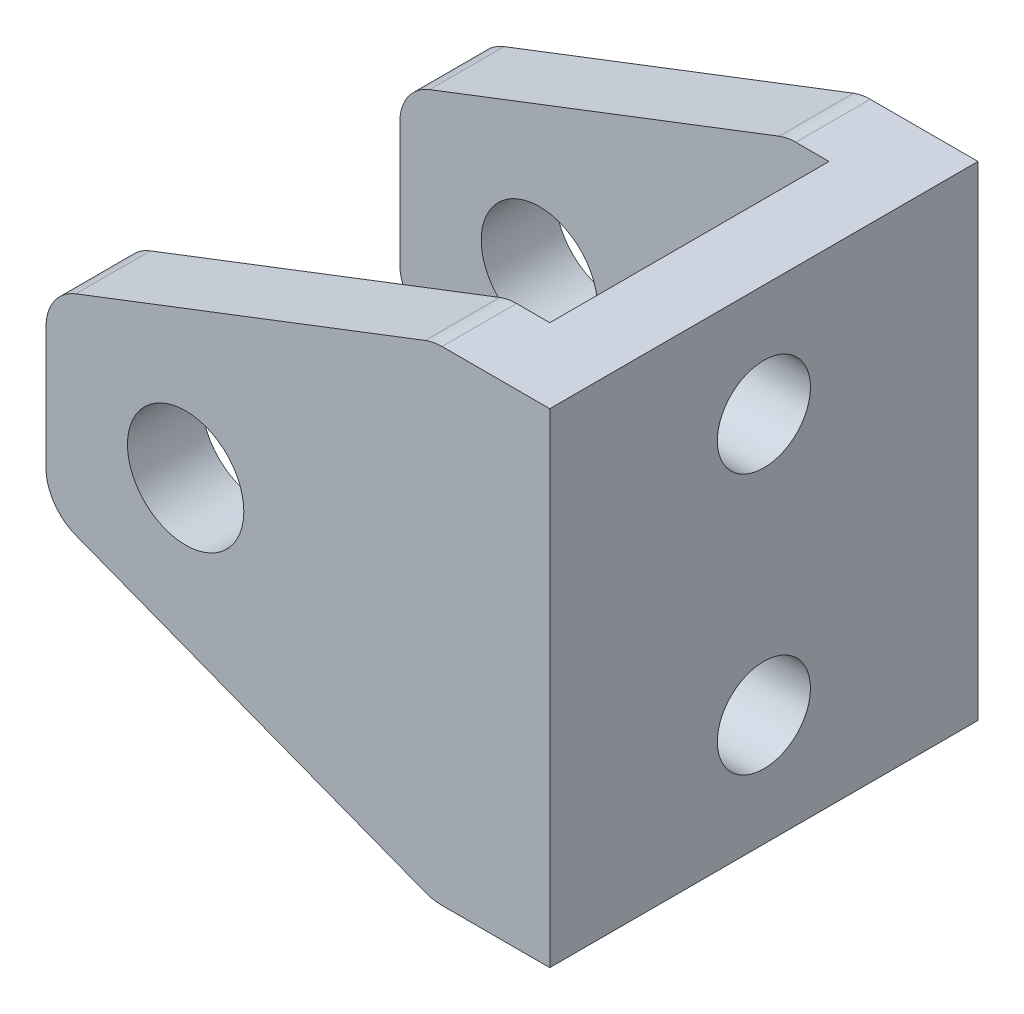
ISO-10303-21;
HEADER;
FILE_DESCRIPTION(('STEP AP214'),'2;1');
FILE_NAME('part.step','',(''),(''),'','','');
FILE_SCHEMA(('AUTOMOTIVE_DESIGN { 1 0 10303 214 1 1 1 1 }'));
ENDSEC;
DATA;
#1=APPLICATION_CONTEXT('core data for automotive mechanical design processes');
#2=APPLICATION_PROTOCOL_DEFINITION('international standard','automotive_design',2000,#1);
#3=PRODUCT_CONTEXT('',#1,'mechanical');
#4=PRODUCT('Part','Part','',(#3));
#5=PRODUCT_RELATED_PRODUCT_CATEGORY('part','',(#4));
#6=PRODUCT_DEFINITION_FORMATION('','',#4);
#7=PRODUCT_DEFINITION_CONTEXT('part definition',#1,'design');
#8=PRODUCT_DEFINITION('design','',#6,#7);
#9=PRODUCT_DEFINITION_SHAPE('','',#8);
#10=(LENGTH_UNIT() NAMED_UNIT(*) SI_UNIT(.MILLI.,.METRE.));
#11=(NAMED_UNIT(*) PLANE_ANGLE_UNIT() SI_UNIT($,.RADIAN.));
#12=(NAMED_UNIT(*) SI_UNIT($,.STERADIAN.) SOLID_ANGLE_UNIT());
#13=UNCERTAINTY_MEASURE_WITH_UNIT(LENGTH_MEASURE(1.E-05),#10,'distance_accuracy_value','');
#14=(GEOMETRIC_REPRESENTATION_CONTEXT(3) GLOBAL_UNCERTAINTY_ASSIGNED_CONTEXT((#13)) GLOBAL_UNIT_ASSIGNED_CONTEXT((#10,
#11,#12)) REPRESENTATION_CONTEXT('',''));
#15=CARTESIAN_POINT('',(0.,0.,0.));
#16=DIRECTION('',(0.,0.,1.));
#17=DIRECTION('',(1.,0.,0.));
#18=AXIS2_PLACEMENT_3D('',#15,#16,#17);
#19=CARTESIAN_POINT('',(1.12817851536598E-13,-792.072062328575,-14.6050000000001));
#20=DIRECTION('',(0.,0.,-1.));
#21=DIRECTION('',(0.,1.,0.));
#22=AXIS2_PLACEMENT_3D('',#19,#20,#21);
#23=PLANE('',#22);
#24=DIRECTION('',(0.933382517435201,0.358883095375536,0.));
#25=VECTOR('',#24,1.);
#26=CARTESIAN_POINT('',(-7.93750000000001,-759.052062328575,-14.6050000000001));
#27=LINE('',#26,#25);
#28=CARTESIAN_POINT('',(-32.3260637938172,-768.429400239445,-14.6050000000001));
#29=VERTEX_POINT('',#28);
#30=CARTESIAN_POINT('',(-8.48759615154714,-759.263572835718,-14.6050000000001));
#31=VERTEX_POINT('',#30);
#32=EDGE_CURVE('E392',#29,#31,#27,.T.);
#33=ORIENTED_EDGE('',*,*,#32,.T.);
#34=CARTESIAN_POINT('',(-7.34814232372982,-762.227062328575,-14.6050000000001));
#35=DIRECTION('',(0.,0.,-1.));
#36=DIRECTION('',(0.,1.,0.));
#37=AXIS2_PLACEMENT_3D('',#34,#35,#36);
#38=CIRCLE('',#37,3.175);
#39=CARTESIAN_POINT('',(-7.34814232372982,-759.052062328575,-14.6050000000001));
#40=VERTEX_POINT('',#39);
#41=EDGE_CURVE('E274',#31,#40,#38,.T.);
#42=ORIENTED_EDGE('',*,*,#41,.T.);
#43=DIRECTION('',(-1.,0.,0.));
#44=VECTOR('',#43,1.);
#45=CARTESIAN_POINT('',(1.07523318846745E-13,-759.052062328575,-14.6050000000001));
#46=LINE('',#45,#44);
#47=CARTESIAN_POINT('',(1.07523318846745E-13,-759.052062328575,-14.6050000000001));
#48=VERTEX_POINT('',#47);
#49=EDGE_CURVE('E216',#48,#40,#46,.T.);
#50=ORIENTED_EDGE('',*,*,#49,.F.);
#51=DIRECTION('',(0.,1.,0.));
#52=VECTOR('',#51,1.);
#53=CARTESIAN_POINT('',(1.12817851536598E-13,-792.072062328575,-14.6050000000001));
#54=LINE('',#53,#52);
#55=CARTESIAN_POINT('',(1.12817851536598E-13,-792.072062328575,-14.6050000000001));
#56=VERTEX_POINT('',#55);
#57=EDGE_CURVE('E231',#56,#48,#54,.T.);
#58=ORIENTED_EDGE('',*,*,#57,.F.);
#59=DIRECTION('',(-1.,0.,0.));
#60=VECTOR('',#59,1.);
#61=CARTESIAN_POINT('',(1.12817851536598E-13,-792.072062328575,-14.6050000000001));
#62=LINE('',#61,#60);
#63=CARTESIAN_POINT('',(-7.34814232372981,-792.072062328575,-14.6050000000001));
#64=VERTEX_POINT('',#63);
#65=EDGE_CURVE('E190',#56,#64,#62,.T.);
#66=ORIENTED_EDGE('',*,*,#65,.T.);
#67=CARTESIAN_POINT('',(-7.34814232372981,-788.897062328575,-14.6050000000001));
#68=DIRECTION('',(0.,0.,-1.));
#69=DIRECTION('',(0.,1.,0.));
#70=AXIS2_PLACEMENT_3D('',#67,#68,#69);
#71=CIRCLE('',#70,3.175);
#72=CARTESIAN_POINT('',(-8.48759615154714,-791.860551821432,-14.6050000000001));
#73=VERTEX_POINT('',#72);
#74=EDGE_CURVE('E272',#64,#73,#71,.T.);
#75=ORIENTED_EDGE('',*,*,#74,.T.);
#76=DIRECTION('',(-0.933382517435201,0.358883095375536,0.));
#77=VECTOR('',#76,1.);
#78=CARTESIAN_POINT('',(-34.3616099659999,-781.912062328575,-14.6050000000001));
#79=LINE('',#78,#77);
#80=CARTESIAN_POINT('',(-32.3260637938172,-782.694724417705,-14.6050000000001));
#81=VERTEX_POINT('',#80);
#82=EDGE_CURVE('E330',#73,#81,#79,.T.);
#83=ORIENTED_EDGE('',*,*,#82,.T.);
#84=CARTESIAN_POINT('',(-31.1866099659999,-779.731234924848,-14.6050000000001));
#85=DIRECTION('',(0.,0.,-1.));
#86=DIRECTION('',(0.,1.,0.));
#87=AXIS2_PLACEMENT_3D('',#84,#85,#86);
#88=CIRCLE('',#87,3.175);
#89=CARTESIAN_POINT('',(-34.3616099659999,-779.731234924848,-14.6050000000001));
#90=VERTEX_POINT('',#89);
#91=EDGE_CURVE('E270',#81,#90,#88,.T.);
#92=ORIENTED_EDGE('',*,*,#91,.T.);
#93=DIRECTION('',(0.,1.,0.));
#94=VECTOR('',#93,1.);
#95=CARTESIAN_POINT('',(-34.3616099659999,-792.072062328575,-14.6050000000001));
#96=LINE('',#95,#94);
#97=CARTESIAN_POINT('',(-34.3616099659999,-771.392889732302,-14.6050000000001));
#98=VERTEX_POINT('',#97);
#99=EDGE_CURVE('E215',#90,#98,#96,.T.);
#100=ORIENTED_EDGE('',*,*,#99,.T.);
#101=CARTESIAN_POINT('',(-31.1866099659999,-771.392889732302,-14.6050000000001));
#102=DIRECTION('',(0.,0.,-1.));
#103=DIRECTION('',(0.,1.,0.));
#104=AXIS2_PLACEMENT_3D('',#101,#102,#103);
#105=CIRCLE('',#104,3.175);
#106=EDGE_CURVE('E268',#98,#29,#105,.T.);
#107=ORIENTED_EDGE('',*,*,#106,.T.);
#108=EDGE_LOOP('',(#33,#42,#50,#58,#66,#75,#83,#92,#100,#107));
#109=FACE_BOUND('',#108,.T.);
#110=CARTESIAN_POINT('',(-24.836609966,-775.562062328575,-14.6050000000001));
#111=DIRECTION('',(0.,0.,1.));
#112=DIRECTION('',(1.,0.,0.));
#113=AXIS2_PLACEMENT_3D('',#110,#111,#112);
#114=CIRCLE('',#113,3.96874999999999);
#115=CARTESIAN_POINT('',(-20.867859966,-775.562062328575,-14.6050000000001));
#116=VERTEX_POINT('',#115);
#117=EDGE_CURVE('E393',#116,#116,#114,.T.);
#118=ORIENTED_EDGE('',*,*,#117,.T.);
#119=EDGE_LOOP('',(#118));
#120=FACE_BOUND('',#119,.T.);
#121=ADVANCED_FACE('F39',(#109,#120),#23,.T.);
#122=CARTESIAN_POINT('',(1.12817851536598E-13,-792.072062328575,-14.6050000000001));
#123=DIRECTION('',(-1.,0.,0.));
#124=DIRECTION('',(0.,-1.,0.));
#125=AXIS2_PLACEMENT_3D('',#122,#123,#124);
#126=PLANE('',#125);
#127=CARTESIAN_POINT('',(1.2578155928591E-13,-784.452062328575,0.));
#128=DIRECTION('',(1.,0.,0.));
#129=DIRECTION('',(0.,1.,0.));
#130=AXIS2_PLACEMENT_3D('',#127,#128,#129);
#131=CIRCLE('',#130,3.175);
#132=CARTESIAN_POINT('',(1.25272469604193E-13,-781.277062328575,0.));
#133=VERTEX_POINT('',#132);
#134=EDGE_CURVE('E220',#133,#133,#131,.T.);
#135=ORIENTED_EDGE('',*,*,#134,.F.);
#136=EDGE_LOOP('',(#135));
#137=FACE_BOUND('',#136,.T.);
#138=CARTESIAN_POINT('',(1.22930657068297E-13,-766.672062328575,0.));
#139=DIRECTION('',(1.,0.,0.));
#140=DIRECTION('',(0.,1.,0.));
#141=AXIS2_PLACEMENT_3D('',#138,#139,#140);
#142=CIRCLE('',#141,3.175);
#143=CARTESIAN_POINT('',(1.2242156738658E-13,-763.497062328575,0.));
#144=VERTEX_POINT('',#143);
#145=EDGE_CURVE('E352',#144,#144,#142,.T.);
#146=ORIENTED_EDGE('',*,*,#145,.F.);
#147=EDGE_LOOP('',(#146));
#148=FACE_BOUND('',#147,.T.);
#149=DIRECTION('',(0.,0.,1.));
#150=VECTOR('',#149,1.);
#151=CARTESIAN_POINT('',(1.07523318846745E-13,-759.052062328575,-14.6050000000001));
#152=LINE('',#151,#150);
#153=CARTESIAN_POINT('',(1.07523318846745E-13,-759.052062328575,14.6049999999999));
#154=VERTEX_POINT('',#153);
#155=EDGE_CURVE('E228',#48,#154,#152,.T.);
#156=ORIENTED_EDGE('',*,*,#155,.T.);
#157=DIRECTION('',(0.,1.,0.));
#158=VECTOR('',#157,1.);
#159=CARTESIAN_POINT('',(1.12817851536598E-13,-792.072062328575,14.6049999999999));
#160=LINE('',#159,#158);
#161=CARTESIAN_POINT('',(1.12817851536598E-13,-792.072062328575,14.6049999999999));
#162=VERTEX_POINT('',#161);
#163=EDGE_CURVE('E234',#162,#154,#160,.T.);
#164=ORIENTED_EDGE('',*,*,#163,.F.);
#165=DIRECTION('',(0.,0.,1.));
#166=VECTOR('',#165,1.);
#167=CARTESIAN_POINT('',(1.12817851536598E-13,-792.072062328575,-14.6050000000001));
#168=LINE('',#167,#166);
#169=EDGE_CURVE('E212',#56,#162,#168,.T.);
#170=ORIENTED_EDGE('',*,*,#169,.F.);
#171=ORIENTED_EDGE('',*,*,#57,.T.);
#172=EDGE_LOOP('',(#156,#164,#170,#171));
#173=FACE_BOUND('',#172,.T.);
#174=ADVANCED_FACE('F415',(#137,#148,#173),#126,.F.);
#175=CARTESIAN_POINT('',(-34.3616099659999,-792.072062328575,14.6049999999999));
#176=DIRECTION('',(0.,0.,1.));
#177=DIRECTION('',(0.,-1.,0.));
#178=AXIS2_PLACEMENT_3D('',#175,#176,#177);
#179=PLANE('',#178);
#180=DIRECTION('',(1.,0.,0.));
#181=VECTOR('',#180,1.);
#182=CARTESIAN_POINT('',(-34.3616099659999,-759.052062328575,14.6049999999999));
#183=LINE('',#182,#181);
#184=CARTESIAN_POINT('',(-7.34814232372982,-759.052062328575,14.6049999999999));
#185=VERTEX_POINT('',#184);
#186=EDGE_CURVE('E226',#185,#154,#183,.T.);
#187=ORIENTED_EDGE('',*,*,#186,.F.);
#188=CARTESIAN_POINT('',(-7.34814232372982,-762.227062328575,14.6049999999999));
#189=DIRECTION('',(0.,0.,1.));
#190=DIRECTION('',(0.,-1.,0.));
#191=AXIS2_PLACEMENT_3D('',#188,#189,#190);
#192=CIRCLE('',#191,3.175);
#193=CARTESIAN_POINT('',(-8.48759615154714,-759.263572835718,14.605));
#194=VERTEX_POINT('',#193);
#195=EDGE_CURVE('E294',#185,#194,#192,.T.);
#196=ORIENTED_EDGE('',*,*,#195,.T.);
#197=DIRECTION('',(0.933382517435201,0.358883095375536,0.));
#198=VECTOR('',#197,1.);
#199=CARTESIAN_POINT('',(-7.93750000000001,-759.052062328575,14.605));
#200=LINE('',#199,#198);
#201=CARTESIAN_POINT('',(-32.3260637938172,-768.429400239445,14.605));
#202=VERTEX_POINT('',#201);
#203=EDGE_CURVE('E403',#202,#194,#200,.T.);
#204=ORIENTED_EDGE('',*,*,#203,.F.);
#205=CARTESIAN_POINT('',(-31.1866099659999,-771.392889732302,14.6049999999999));
#206=DIRECTION('',(0.,0.,1.));
#207=DIRECTION('',(0.,-1.,0.));
#208=AXIS2_PLACEMENT_3D('',#205,#206,#207);
#209=CIRCLE('',#208,3.175);
#210=CARTESIAN_POINT('',(-34.3616099659999,-771.392889732302,14.6049999999999));
#211=VERTEX_POINT('',#210);
#212=EDGE_CURVE('E54',#202,#211,#209,.T.);
#213=ORIENTED_EDGE('',*,*,#212,.T.);
#214=DIRECTION('',(0.,1.,0.));
#215=VECTOR('',#214,1.);
#216=CARTESIAN_POINT('',(-34.3616099659999,-792.072062328575,14.6049999999999));
#217=LINE('',#216,#215);
#218=CARTESIAN_POINT('',(-34.3616099659999,-779.731234924848,14.6049999999999));
#219=VERTEX_POINT('',#218);
#220=EDGE_CURVE('E237',#219,#211,#217,.T.);
#221=ORIENTED_EDGE('',*,*,#220,.F.);
#222=CARTESIAN_POINT('',(-31.1866099659999,-779.731234924848,14.6049999999999));
#223=DIRECTION('',(0.,0.,1.));
#224=DIRECTION('',(0.,-1.,0.));
#225=AXIS2_PLACEMENT_3D('',#222,#223,#224);
#226=CIRCLE('',#225,3.175);
#227=CARTESIAN_POINT('',(-32.3260637938172,-782.694724417705,14.605));
#228=VERTEX_POINT('',#227);
#229=EDGE_CURVE('E62',#219,#228,#226,.T.);
#230=ORIENTED_EDGE('',*,*,#229,.T.);
#231=DIRECTION('',(-0.933382517435201,0.358883095375536,0.));
#232=VECTOR('',#231,1.);
#233=CARTESIAN_POINT('',(-34.3616099659999,-781.912062328575,14.605));
#234=LINE('',#233,#232);
#235=CARTESIAN_POINT('',(-8.48759615154714,-791.860551821432,14.605));
#236=VERTEX_POINT('',#235);
#237=EDGE_CURVE('E323',#236,#228,#234,.T.);
#238=ORIENTED_EDGE('',*,*,#237,.F.);
#239=CARTESIAN_POINT('',(-7.34814232372981,-788.897062328575,14.6049999999999));
#240=DIRECTION('',(0.,0.,1.));
#241=DIRECTION('',(0.,-1.,0.));
#242=AXIS2_PLACEMENT_3D('',#239,#240,#241);
#243=CIRCLE('',#242,3.175);
#244=CARTESIAN_POINT('',(-7.34814232372981,-792.072062328575,14.6049999999999));
#245=VERTEX_POINT('',#244);
#246=EDGE_CURVE('E292',#236,#245,#243,.T.);
#247=ORIENTED_EDGE('',*,*,#246,.T.);
#248=DIRECTION('',(1.,0.,0.));
#249=VECTOR('',#248,1.);
#250=CARTESIAN_POINT('',(-34.3616099659999,-792.072062328575,14.6049999999999));
#251=LINE('',#250,#249);
#252=EDGE_CURVE('E207',#245,#162,#251,.T.);
#253=ORIENTED_EDGE('',*,*,#252,.T.);
#254=ORIENTED_EDGE('',*,*,#163,.T.);
#255=EDGE_LOOP('',(#187,#196,#204,#213,#221,#230,#238,#247,#253,#254));
#256=FACE_BOUND('',#255,.T.);
#257=CARTESIAN_POINT('',(-24.836609966,-775.562062328575,14.605));
#258=DIRECTION('',(0.,0.,1.));
#259=DIRECTION('',(1.,0.,0.));
#260=AXIS2_PLACEMENT_3D('',#257,#258,#259);
#261=CIRCLE('',#260,3.96874999999999);
#262=CARTESIAN_POINT('',(-20.867859966,-775.562062328575,14.605));
#263=VERTEX_POINT('',#262);
#264=EDGE_CURVE('E397',#263,#263,#261,.T.);
#265=ORIENTED_EDGE('',*,*,#264,.F.);
#266=EDGE_LOOP('',(#265));
#267=FACE_BOUND('',#266,.T.);
#268=ADVANCED_FACE('F319',(#256,#267),#179,.T.);
#269=CARTESIAN_POINT('',(-34.3616099659999,-792.072062328575,9.52499999999988));
#270=DIRECTION('',(-1.,0.,0.));
#271=DIRECTION('',(0.,0.,1.));
#272=AXIS2_PLACEMENT_3D('',#269,#270,#271);
#273=PLANE('',#272);
#274=ORIENTED_EDGE('',*,*,#220,.T.);
#275=DIRECTION('',(0.,0.,1.));
#276=VECTOR('',#275,1.);
#277=CARTESIAN_POINT('',(-34.3616099659999,-771.392889732302,9.52499999999989));
#278=LINE('',#277,#276);
#279=CARTESIAN_POINT('',(-34.3616099659999,-771.392889732302,9.52499999999988));
#280=VERTEX_POINT('',#279);
#281=EDGE_CURVE('E11',#211,#280,#278,.F.);
#282=ORIENTED_EDGE('',*,*,#281,.T.);
#283=DIRECTION('',(0.,1.,0.));
#284=VECTOR('',#283,1.);
#285=CARTESIAN_POINT('',(-34.3616099659999,-792.072062328575,9.52499999999988));
#286=LINE('',#285,#284);
#287=CARTESIAN_POINT('',(-34.3616099659999,-779.731234924848,9.52499999999988));
#288=VERTEX_POINT('',#287);
#289=EDGE_CURVE('E239',#288,#280,#286,.T.);
#290=ORIENTED_EDGE('',*,*,#289,.F.);
#291=DIRECTION('',(0.,0.,1.));
#292=VECTOR('',#291,1.);
#293=CARTESIAN_POINT('',(-34.3616099659999,-779.731234924848,14.605));
#294=LINE('',#293,#292);
#295=EDGE_CURVE('E47',#288,#219,#294,.T.);
#296=ORIENTED_EDGE('',*,*,#295,.T.);
#297=EDGE_LOOP('',(#274,#282,#290,#296));
#298=FACE_BOUND('',#297,.T.);
#299=ADVANCED_FACE('F315',(#298),#273,.T.);
#300=CARTESIAN_POINT('',(-5.07999999999989,-792.072062328575,9.52499999999988));
#301=DIRECTION('',(0.,0.,-1.));
#302=DIRECTION('',(0.,1.,0.));
#303=AXIS2_PLACEMENT_3D('',#300,#301,#302);
#304=PLANE('',#303);
#305=DIRECTION('',(-0.933382517435201,-0.358883095375536,0.));
#306=VECTOR('',#305,1.);
#307=CARTESIAN_POINT('',(-16.5089189811049,-762.347750128848,9.52499999999988));
#308=LINE('',#307,#306);
#309=CARTESIAN_POINT('',(-8.48759615154716,-759.263572835718,9.52499999999988));
#310=VERTEX_POINT('',#309);
#311=CARTESIAN_POINT('',(-32.3260637938172,-768.429400239445,9.52499999999988));
#312=VERTEX_POINT('',#311);
#313=EDGE_CURVE('E340',#310,#312,#308,.T.);
#314=ORIENTED_EDGE('',*,*,#313,.F.);
#315=CARTESIAN_POINT('',(-7.34814232372982,-762.227062328575,9.52499999999988));
#316=DIRECTION('',(0.,0.,-1.));
#317=DIRECTION('',(0.,1.,0.));
#318=AXIS2_PLACEMENT_3D('',#315,#316,#317);
#319=CIRCLE('',#318,3.175);
#320=CARTESIAN_POINT('',(-7.34814232372982,-759.052062328575,9.52499999999988));
#321=VERTEX_POINT('',#320);
#322=EDGE_CURVE('E288',#310,#321,#319,.T.);
#323=ORIENTED_EDGE('',*,*,#322,.T.);
#324=DIRECTION('',(-1.,0.,0.));
#325=VECTOR('',#324,1.);
#326=CARTESIAN_POINT('',(-5.07999999999989,-759.052062328575,9.52499999999988));
#327=LINE('',#326,#325);
#328=CARTESIAN_POINT('',(-5.07999999999989,-759.052062328575,9.52499999999988));
#329=VERTEX_POINT('',#328);
#330=EDGE_CURVE('E223',#329,#321,#327,.T.);
#331=ORIENTED_EDGE('',*,*,#330,.F.);
#332=DIRECTION('',(0.,1.,0.));
#333=VECTOR('',#332,1.);
#334=CARTESIAN_POINT('',(-5.07999999999989,-792.072062328575,9.52499999999988));
#335=LINE('',#334,#333);
#336=CARTESIAN_POINT('',(-5.07999999999989,-792.072062328575,9.52499999999988));
#337=VERTEX_POINT('',#336);
#338=EDGE_CURVE('E197',#337,#329,#335,.T.);
#339=ORIENTED_EDGE('',*,*,#338,.F.);
#340=DIRECTION('',(-1.,0.,0.));
#341=VECTOR('',#340,1.);
#342=CARTESIAN_POINT('',(-5.07999999999989,-792.072062328575,9.52499999999988));
#343=LINE('',#342,#341);
#344=CARTESIAN_POINT('',(-7.34814232372981,-792.072062328575,9.52499999999988));
#345=VERTEX_POINT('',#344);
#346=EDGE_CURVE('E205',#337,#345,#343,.T.);
#347=ORIENTED_EDGE('',*,*,#346,.T.);
#348=CARTESIAN_POINT('',(-7.34814232372981,-788.897062328575,9.52499999999988));
#349=DIRECTION('',(0.,0.,-1.));
#350=DIRECTION('',(0.,1.,0.));
#351=AXIS2_PLACEMENT_3D('',#348,#349,#350);
#352=CIRCLE('',#351,3.175);
#353=CARTESIAN_POINT('',(-8.48759615154712,-791.860551821432,9.52499999999988));
#354=VERTEX_POINT('',#353);
#355=EDGE_CURVE('E286',#345,#354,#352,.T.);
#356=ORIENTED_EDGE('',*,*,#355,.T.);
#357=DIRECTION('',(0.933382517435201,-0.358883095375536,0.));
#358=VECTOR('',#357,1.);
#359=CARTESIAN_POINT('',(-5.44803764508803,-793.029253982653,9.52499999999988));
#360=LINE('',#359,#358);
#361=CARTESIAN_POINT('',(-32.3260637938172,-782.694724417704,9.52499999999988));
#362=VERTEX_POINT('',#361);
#363=EDGE_CURVE('E251',#362,#354,#360,.T.);
#364=ORIENTED_EDGE('',*,*,#363,.F.);
#365=CARTESIAN_POINT('',(-31.1866099659999,-779.731234924848,9.52499999999988));
#366=DIRECTION('',(0.,0.,-1.));
#367=DIRECTION('',(0.,1.,0.));
#368=AXIS2_PLACEMENT_3D('',#365,#366,#367);
#369=CIRCLE('',#368,3.175);
#370=EDGE_CURVE('E282',#362,#288,#369,.T.);
#371=ORIENTED_EDGE('',*,*,#370,.T.);
#372=ORIENTED_EDGE('',*,*,#289,.T.);
#373=CARTESIAN_POINT('',(-31.1866099659999,-771.392889732302,9.52499999999988));
#374=DIRECTION('',(0.,0.,-1.));
#375=DIRECTION('',(0.,1.,0.));
#376=AXIS2_PLACEMENT_3D('',#373,#374,#375);
#377=CIRCLE('',#376,3.175);
#378=EDGE_CURVE('E284',#280,#312,#377,.T.);
#379=ORIENTED_EDGE('',*,*,#378,.T.);
#380=EDGE_LOOP('',(#314,#323,#331,#339,#347,#356,#364,#371,#372,#379));
#381=FACE_BOUND('',#380,.T.);
#382=CARTESIAN_POINT('',(-24.836609966,-775.562062328575,9.52499999999988));
#383=DIRECTION('',(0.,0.,-1.));
#384=DIRECTION('',(0.,1.,0.));
#385=AXIS2_PLACEMENT_3D('',#382,#383,#384);
#386=CIRCLE('',#385,3.96874999999999);
#387=CARTESIAN_POINT('',(-24.836609966,-771.593312328575,9.52499999999988));
#388=VERTEX_POINT('',#387);
#389=EDGE_CURVE('E250',#388,#388,#386,.T.);
#390=ORIENTED_EDGE('',*,*,#389,.F.);
#391=EDGE_LOOP('',(#390));
#392=FACE_BOUND('',#391,.T.);
#393=ADVANCED_FACE('F334',(#381,#392),#304,.T.);
#394=CARTESIAN_POINT('',(-5.07999999999988,-792.072062328575,-9.5250000000001));
#395=DIRECTION('',(-1.,0.,0.));
#396=DIRECTION('',(0.,0.,1.));
#397=AXIS2_PLACEMENT_3D('',#394,#395,#396);
#398=PLANE('',#397);
#399=CARTESIAN_POINT('',(-5.07999999999989,-784.452062328575,0.));
#400=DIRECTION('',(-1.,0.,0.));
#401=DIRECTION('',(0.,0.,1.));
#402=AXIS2_PLACEMENT_3D('',#399,#400,#401);
#403=CIRCLE('',#402,3.175);
#404=CARTESIAN_POINT('',(-5.07999999999989,-784.452062328575,3.175));
#405=VERTEX_POINT('',#404);
#406=EDGE_CURVE('E349',#405,#405,#403,.F.);
#407=ORIENTED_EDGE('',*,*,#406,.T.);
#408=EDGE_LOOP('',(#407));
#409=FACE_BOUND('',#408,.T.);
#410=CARTESIAN_POINT('',(-5.07999999999989,-766.672062328575,0.));
#411=DIRECTION('',(-1.,0.,0.));
#412=DIRECTION('',(0.,0.,1.));
#413=AXIS2_PLACEMENT_3D('',#410,#411,#412);
#414=CIRCLE('',#413,3.175);
#415=CARTESIAN_POINT('',(-5.07999999999989,-766.672062328575,3.175));
#416=VERTEX_POINT('',#415);
#417=EDGE_CURVE('E346',#416,#416,#414,.F.);
#418=ORIENTED_EDGE('',*,*,#417,.T.);
#419=EDGE_LOOP('',(#418));
#420=FACE_BOUND('',#419,.T.);
#421=DIRECTION('',(0.,0.,1.));
#422=VECTOR('',#421,1.);
#423=CARTESIAN_POINT('',(-5.07999999999989,-759.052062328575,-9.5250000000001));
#424=LINE('',#423,#422);
#425=CARTESIAN_POINT('',(-5.07999999999989,-759.052062328575,-9.5250000000001));
#426=VERTEX_POINT('',#425);
#427=EDGE_CURVE('E196',#426,#329,#424,.T.);
#428=ORIENTED_EDGE('',*,*,#427,.F.);
#429=DIRECTION('',(0.,1.,0.));
#430=VECTOR('',#429,1.);
#431=CARTESIAN_POINT('',(-5.07999999999988,-792.072062328575,-9.5250000000001));
#432=LINE('',#431,#430);
#433=CARTESIAN_POINT('',(-5.07999999999988,-792.072062328575,-9.5250000000001));
#434=VERTEX_POINT('',#433);
#435=EDGE_CURVE('E182',#434,#426,#432,.T.);
#436=ORIENTED_EDGE('',*,*,#435,.F.);
#437=DIRECTION('',(0.,0.,1.));
#438=VECTOR('',#437,1.);
#439=CARTESIAN_POINT('',(-5.07999999999988,-792.072062328575,-9.5250000000001));
#440=LINE('',#439,#438);
#441=EDGE_CURVE('E189',#434,#337,#440,.T.);
#442=ORIENTED_EDGE('',*,*,#441,.T.);
#443=ORIENTED_EDGE('',*,*,#338,.T.);
#444=EDGE_LOOP('',(#428,#436,#442,#443));
#445=FACE_BOUND('',#444,.T.);
#446=ADVANCED_FACE('F194',(#409,#420,#445),#398,.T.);
#447=CARTESIAN_POINT('',(-34.3616099659999,-792.072062328575,-9.52500000000007));
#448=DIRECTION('',(0.,0.,1.));
#449=DIRECTION('',(1.,0.,0.));
#450=AXIS2_PLACEMENT_3D('',#447,#448,#449);
#451=PLANE('',#450);
#452=DIRECTION('',(1.,0.,0.));
#453=VECTOR('',#452,1.);
#454=CARTESIAN_POINT('',(-34.3616099659999,-759.052062328575,-9.52500000000007));
#455=LINE('',#454,#453);
#456=CARTESIAN_POINT('',(-7.34814232372982,-759.052062328575,-9.5250000000001));
#457=VERTEX_POINT('',#456);
#458=EDGE_CURVE('E219',#457,#426,#455,.T.);
#459=ORIENTED_EDGE('',*,*,#458,.F.);
#460=CARTESIAN_POINT('',(-7.34814232372982,-762.227062328575,-9.5250000000001));
#461=DIRECTION('',(0.,0.,1.));
#462=DIRECTION('',(1.,0.,0.));
#463=AXIS2_PLACEMENT_3D('',#460,#461,#462);
#464=CIRCLE('',#463,3.175);
#465=CARTESIAN_POINT('',(-8.48759615154715,-759.263572835718,-9.52500000000009));
#466=VERTEX_POINT('',#465);
#467=EDGE_CURVE('E261',#457,#466,#464,.T.);
#468=ORIENTED_EDGE('',*,*,#467,.T.);
#469=DIRECTION('',(0.933382517435201,0.358883095375536,0.));
#470=VECTOR('',#469,1.);
#471=CARTESIAN_POINT('',(-42.019143198627,-772.15636348928,-9.52500000000006));
#472=LINE('',#471,#470);
#473=CARTESIAN_POINT('',(-32.3260637938172,-768.429400239445,-9.52500000000007));
#474=VERTEX_POINT('',#473);
#475=EDGE_CURVE('E390',#474,#466,#472,.T.);
#476=ORIENTED_EDGE('',*,*,#475,.F.);
#477=CARTESIAN_POINT('',(-31.1866099659999,-771.392889732302,-9.52500000000007));
#478=DIRECTION('',(0.,0.,1.));
#479=DIRECTION('',(1.,0.,0.));
#480=AXIS2_PLACEMENT_3D('',#477,#478,#479);
#481=CIRCLE('',#480,3.175);
#482=CARTESIAN_POINT('',(-34.3616099659999,-771.392889732302,-9.52500000000007));
#483=VERTEX_POINT('',#482);
#484=EDGE_CURVE('E256',#474,#483,#481,.T.);
#485=ORIENTED_EDGE('',*,*,#484,.T.);
#486=DIRECTION('',(0.,1.,0.));
#487=VECTOR('',#486,1.);
#488=CARTESIAN_POINT('',(-34.3616099659999,-792.072062328575,-9.52500000000007));
#489=LINE('',#488,#487);
#490=CARTESIAN_POINT('',(-34.3616099659999,-779.731234924848,-9.52500000000007));
#491=VERTEX_POINT('',#490);
#492=EDGE_CURVE('E198',#491,#483,#489,.T.);
#493=ORIENTED_EDGE('',*,*,#492,.F.);
#494=CARTESIAN_POINT('',(-31.1866099659999,-779.731234924848,-9.52500000000008));
#495=DIRECTION('',(0.,0.,1.));
#496=DIRECTION('',(1.,0.,0.));
#497=AXIS2_PLACEMENT_3D('',#494,#495,#496);
#498=CIRCLE('',#497,3.175);
#499=CARTESIAN_POINT('',(-32.3260637938172,-782.694724417704,-9.52500000000007));
#500=VERTEX_POINT('',#499);
#501=EDGE_CURVE('E258',#491,#500,#498,.T.);
#502=ORIENTED_EDGE('',*,*,#501,.T.);
#503=DIRECTION('',(-0.933382517435201,0.358883095375536,0.));
#504=VECTOR('',#503,1.);
#505=CARTESIAN_POINT('',(-30.9582618626101,-783.220640622222,-9.52500000000008));
#506=LINE('',#505,#504);
#507=CARTESIAN_POINT('',(-8.48759615154711,-791.860551821432,-9.5250000000001));
#508=VERTEX_POINT('',#507);
#509=EDGE_CURVE('E337',#508,#500,#506,.T.);
#510=ORIENTED_EDGE('',*,*,#509,.F.);
#511=CARTESIAN_POINT('',(-7.34814232372981,-788.897062328575,-9.5250000000001));
#512=DIRECTION('',(0.,0.,1.));
#513=DIRECTION('',(1.,0.,0.));
#514=AXIS2_PLACEMENT_3D('',#511,#512,#513);
#515=CIRCLE('',#514,3.175);
#516=CARTESIAN_POINT('',(-7.34814232372981,-792.072062328575,-9.5250000000001));
#517=VERTEX_POINT('',#516);
#518=EDGE_CURVE('E185',#508,#517,#515,.T.);
#519=ORIENTED_EDGE('',*,*,#518,.T.);
#520=DIRECTION('',(1.,0.,0.));
#521=VECTOR('',#520,1.);
#522=CARTESIAN_POINT('',(-34.3616099659999,-792.072062328575,-9.52500000000007));
#523=LINE('',#522,#521);
#524=EDGE_CURVE('E177',#517,#434,#523,.T.);
#525=ORIENTED_EDGE('',*,*,#524,.T.);
#526=ORIENTED_EDGE('',*,*,#435,.T.);
#527=EDGE_LOOP('',(#459,#468,#476,#485,#493,#502,#510,#519,#525,#526));
#528=FACE_BOUND('',#527,.T.);
#529=CARTESIAN_POINT('',(-24.836609966,-775.562062328575,-9.52500000000008));
#530=DIRECTION('',(0.,0.,1.));
#531=DIRECTION('',(1.,0.,0.));
#532=AXIS2_PLACEMENT_3D('',#529,#530,#531);
#533=CIRCLE('',#532,3.96874999999999);
#534=CARTESIAN_POINT('',(-20.867859966,-775.562062328575,-9.52500000000009));
#535=VERTEX_POINT('',#534);
#536=EDGE_CURVE('E247',#535,#535,#533,.T.);
#537=ORIENTED_EDGE('',*,*,#536,.F.);
#538=EDGE_LOOP('',(#537));
#539=FACE_BOUND('',#538,.T.);
#540=ADVANCED_FACE('F180',(#528,#539),#451,.T.);
#541=CARTESIAN_POINT('',(-34.3616099659999,-792.072062328575,-14.6050000000001));
#542=DIRECTION('',(-1.,0.,0.));
#543=DIRECTION('',(0.,-1.,0.));
#544=AXIS2_PLACEMENT_3D('',#541,#542,#543);
#545=PLANE('',#544);
#546=ORIENTED_EDGE('',*,*,#99,.F.);
#547=DIRECTION('',(0.,0.,1.));
#548=VECTOR('',#547,1.);
#549=CARTESIAN_POINT('',(-34.3616099659999,-779.731234924848,-9.52500000000007));
#550=LINE('',#549,#548);
#551=EDGE_CURVE('E311',#90,#491,#550,.T.);
#552=ORIENTED_EDGE('',*,*,#551,.T.);
#553=ORIENTED_EDGE('',*,*,#492,.T.);
#554=DIRECTION('',(0.,0.,1.));
#555=VECTOR('',#554,1.);
#556=CARTESIAN_POINT('',(-34.3616099659999,-771.392889732302,-14.6050000000001));
#557=LINE('',#556,#555);
#558=EDGE_CURVE('E309',#483,#98,#557,.F.);
#559=ORIENTED_EDGE('',*,*,#558,.T.);
#560=EDGE_LOOP('',(#546,#552,#553,#559));
#561=FACE_BOUND('',#560,.T.);
#562=ADVANCED_FACE('F379',(#561),#545,.T.);
#563=CARTESIAN_POINT('',(0.,-792.072062328575,0.));
#564=DIRECTION('',(0.,1.,0.));
#565=DIRECTION('',(0.,0.,1.));
#566=AXIS2_PLACEMENT_3D('',#563,#564,#565);
#567=PLANE('',#566);
#568=ORIENTED_EDGE('',*,*,#252,.F.);
#569=DIRECTION('',(0.,0.,-1.));
#570=VECTOR('',#569,1.);
#571=CARTESIAN_POINT('',(-7.34814232372981,-792.072062328575,0.));
#572=LINE('',#571,#570);
#573=EDGE_CURVE('E298',#245,#345,#572,.T.);
#574=ORIENTED_EDGE('',*,*,#573,.T.);
#575=ORIENTED_EDGE('',*,*,#346,.F.);
#576=ORIENTED_EDGE('',*,*,#441,.F.);
#577=ORIENTED_EDGE('',*,*,#524,.F.);
#578=DIRECTION('',(0.,0.,1.));
#579=VECTOR('',#578,1.);
#580=CARTESIAN_POINT('',(-7.34814232372981,-792.072062328575,0.));
#581=LINE('',#580,#579);
#582=EDGE_CURVE('E296',#517,#64,#581,.F.);
#583=ORIENTED_EDGE('',*,*,#582,.T.);
#584=ORIENTED_EDGE('',*,*,#65,.F.);
#585=ORIENTED_EDGE('',*,*,#169,.T.);
#586=EDGE_LOOP('',(#568,#574,#575,#576,#577,#583,#584,#585));
#587=FACE_BOUND('',#586,.T.);
#588=ADVANCED_FACE('F202',(#587),#567,.F.);
#589=CARTESIAN_POINT('',(0.,-759.052062328575,0.));
#590=DIRECTION('',(0.,1.,0.));
#591=DIRECTION('',(0.,0.,1.));
#592=AXIS2_PLACEMENT_3D('',#589,#590,#591);
#593=PLANE('',#592);
#594=ORIENTED_EDGE('',*,*,#49,.T.);
#595=DIRECTION('',(0.,0.,1.));
#596=VECTOR('',#595,1.);
#597=CARTESIAN_POINT('',(-7.34814232372982,-759.052062328575,-9.52500000000009));
#598=LINE('',#597,#596);
#599=EDGE_CURVE('E253',#40,#457,#598,.T.);
#600=ORIENTED_EDGE('',*,*,#599,.T.);
#601=ORIENTED_EDGE('',*,*,#458,.T.);
#602=ORIENTED_EDGE('',*,*,#427,.T.);
#603=ORIENTED_EDGE('',*,*,#330,.T.);
#604=DIRECTION('',(0.,0.,-1.));
#605=VECTOR('',#604,1.);
#606=CARTESIAN_POINT('',(-7.34814232372982,-759.052062328575,14.6049999999999));
#607=LINE('',#606,#605);
#608=EDGE_CURVE('E233',#321,#185,#607,.F.);
#609=ORIENTED_EDGE('',*,*,#608,.T.);
#610=ORIENTED_EDGE('',*,*,#186,.T.);
#611=ORIENTED_EDGE('',*,*,#155,.F.);
#612=EDGE_LOOP('',(#594,#600,#601,#602,#603,#609,#610,#611));
#613=FACE_BOUND('',#612,.T.);
#614=ADVANCED_FACE('F411',(#613),#593,.T.);
#615=CARTESIAN_POINT('',(-34.3626099659999,-766.672062328575,0.));
#616=DIRECTION('',(1.,0.,0.));
#617=DIRECTION('',(0.,1.,0.));
#618=AXIS2_PLACEMENT_3D('',#615,#616,#617);
#619=CYLINDRICAL_SURFACE('',#618,3.175);
#620=ORIENTED_EDGE('',*,*,#417,.F.);
#621=EDGE_LOOP('',(#620));
#622=FACE_BOUND('',#621,.T.);
#623=ORIENTED_EDGE('',*,*,#145,.T.);
#624=EDGE_LOOP('',(#623));
#625=FACE_BOUND('',#624,.T.);
#626=ADVANCED_FACE('F458',(#622,#625),#619,.F.);
#627=CARTESIAN_POINT('',(-34.3626099659999,-784.452062328575,0.));
#628=DIRECTION('',(1.,0.,0.));
#629=DIRECTION('',(0.,1.,0.));
#630=AXIS2_PLACEMENT_3D('',#627,#628,#629);
#631=CYLINDRICAL_SURFACE('',#630,3.175);
#632=ORIENTED_EDGE('',*,*,#406,.F.);
#633=EDGE_LOOP('',(#632));
#634=FACE_BOUND('',#633,.T.);
#635=ORIENTED_EDGE('',*,*,#134,.T.);
#636=EDGE_LOOP('',(#635));
#637=FACE_BOUND('',#636,.T.);
#638=ADVANCED_FACE('F455',(#634,#637),#631,.F.);
#639=CARTESIAN_POINT('',(-7.93750000000001,-759.052062328575,-14.6050000000001));
#640=DIRECTION('',(0.358883095375536,-0.933382517435201,0.));
#641=DIRECTION('',(0.933382517435201,0.358883095375536,0.));
#642=AXIS2_PLACEMENT_3D('',#639,#640,#641);
#643=PLANE('',#642);
#644=ORIENTED_EDGE('',*,*,#475,.T.);
#645=DIRECTION('',(0.,0.,1.));
#646=VECTOR('',#645,1.);
#647=CARTESIAN_POINT('',(-8.48759615154714,-759.263572835718,-14.6050000000001));
#648=LINE('',#647,#646);
#649=EDGE_CURVE('E266',#466,#31,#648,.F.);
#650=ORIENTED_EDGE('',*,*,#649,.T.);
#651=ORIENTED_EDGE('',*,*,#32,.F.);
#652=DIRECTION('',(0.,0.,1.));
#653=VECTOR('',#652,1.);
#654=CARTESIAN_POINT('',(-32.3260637938172,-768.429400239445,-9.52500000000007));
#655=LINE('',#654,#653);
#656=EDGE_CURVE('E263',#29,#474,#655,.T.);
#657=ORIENTED_EDGE('',*,*,#656,.T.);
#658=EDGE_LOOP('',(#644,#650,#651,#657));
#659=FACE_BOUND('',#658,.T.);
#660=ADVANCED_FACE('F389',(#659),#643,.F.);
#661=ORIENTED_EDGE('',*,*,#203,.T.);
#662=DIRECTION('',(0.,0.,-1.));
#663=VECTOR('',#662,1.);
#664=CARTESIAN_POINT('',(-8.48759615154714,-759.263572835718,9.52499999999987));
#665=LINE('',#664,#663);
#666=EDGE_CURVE('E279',#194,#310,#665,.T.);
#667=ORIENTED_EDGE('',*,*,#666,.T.);
#668=ORIENTED_EDGE('',*,*,#313,.T.);
#669=DIRECTION('',(0.,0.,1.));
#670=VECTOR('',#669,1.);
#671=CARTESIAN_POINT('',(-32.3260637938172,-768.429400239445,14.605));
#672=LINE('',#671,#670);
#673=EDGE_CURVE('E276',#312,#202,#672,.T.);
#674=ORIENTED_EDGE('',*,*,#673,.T.);
#675=EDGE_LOOP('',(#661,#667,#668,#674));
#676=FACE_BOUND('',#675,.T.);
#677=ADVANCED_FACE('F505',(#676),#643,.F.);
#678=CARTESIAN_POINT('',(-34.3616099659999,-781.912062328575,-14.6050000000001));
#679=DIRECTION('',(0.358883095375536,0.933382517435201,0.));
#680=DIRECTION('',(-0.933382517435201,0.358883095375536,0.));
#681=AXIS2_PLACEMENT_3D('',#678,#679,#680);
#682=PLANE('',#681);
#683=ORIENTED_EDGE('',*,*,#82,.F.);
#684=DIRECTION('',(0.,0.,1.));
#685=VECTOR('',#684,1.);
#686=CARTESIAN_POINT('',(-8.48759615154712,-791.860551821432,-14.6050000000001));
#687=LINE('',#686,#685);
#688=EDGE_CURVE('E306',#73,#508,#687,.T.);
#689=ORIENTED_EDGE('',*,*,#688,.T.);
#690=ORIENTED_EDGE('',*,*,#509,.T.);
#691=DIRECTION('',(0.,0.,1.));
#692=VECTOR('',#691,1.);
#693=CARTESIAN_POINT('',(-32.3260637938172,-782.694724417705,-14.6050000000001));
#694=LINE('',#693,#692);
#695=EDGE_CURVE('E304',#500,#81,#694,.F.);
#696=ORIENTED_EDGE('',*,*,#695,.T.);
#697=EDGE_LOOP('',(#683,#689,#690,#696));
#698=FACE_BOUND('',#697,.T.);
#699=ADVANCED_FACE('F370',(#698),#682,.F.);
#700=ORIENTED_EDGE('',*,*,#363,.T.);
#701=DIRECTION('',(0.,0.,-1.));
#702=VECTOR('',#701,1.);
#703=CARTESIAN_POINT('',(-8.48759615154713,-791.860551821432,-14.6050000000001));
#704=LINE('',#703,#702);
#705=EDGE_CURVE('E302',#354,#236,#704,.F.);
#706=ORIENTED_EDGE('',*,*,#705,.T.);
#707=ORIENTED_EDGE('',*,*,#237,.T.);
#708=DIRECTION('',(0.,0.,1.));
#709=VECTOR('',#708,1.);
#710=CARTESIAN_POINT('',(-32.3260637938172,-782.694724417705,9.52499999999988));
#711=LINE('',#710,#709);
#712=EDGE_CURVE('E300',#228,#362,#711,.F.);
#713=ORIENTED_EDGE('',*,*,#712,.T.);
#714=EDGE_LOOP('',(#700,#706,#707,#713));
#715=FACE_BOUND('',#714,.T.);
#716=ADVANCED_FACE('F327',(#715),#682,.F.);
#717=CARTESIAN_POINT('',(-24.836609966,-775.562062328575,-14.6050000000001));
#718=DIRECTION('',(0.,0.,1.));
#719=DIRECTION('',(1.,0.,0.));
#720=AXIS2_PLACEMENT_3D('',#717,#718,#719);
#721=CYLINDRICAL_SURFACE('',#720,3.96874999999999);
#722=ORIENTED_EDGE('',*,*,#536,.T.);
#723=EDGE_LOOP('',(#722));
#724=FACE_BOUND('',#723,.T.);
#725=ORIENTED_EDGE('',*,*,#117,.F.);
#726=EDGE_LOOP('',(#725));
#727=FACE_BOUND('',#726,.T.);
#728=ADVANCED_FACE('F444',(#724,#727),#721,.F.);
#729=ORIENTED_EDGE('',*,*,#389,.T.);
#730=EDGE_LOOP('',(#729));
#731=FACE_BOUND('',#730,.T.);
#732=ORIENTED_EDGE('',*,*,#264,.T.);
#733=EDGE_LOOP('',(#732));
#734=FACE_BOUND('',#733,.T.);
#735=ADVANCED_FACE('F440',(#731,#734),#721,.F.);
#736=CARTESIAN_POINT('',(-7.34814232372982,-762.227062328575,0.));
#737=DIRECTION('',(0.,0.,-1.));
#738=DIRECTION('',(-1.,0.,0.));
#739=AXIS2_PLACEMENT_3D('',#736,#737,#738);
#740=CYLINDRICAL_SURFACE('',#739,3.175);
#741=ORIENTED_EDGE('',*,*,#41,.F.);
#742=ORIENTED_EDGE('',*,*,#649,.F.);
#743=ORIENTED_EDGE('',*,*,#467,.F.);
#744=ORIENTED_EDGE('',*,*,#599,.F.);
#745=EDGE_LOOP('',(#741,#742,#743,#744));
#746=FACE_BOUND('',#745,.T.);
#747=ADVANCED_FACE('F409',(#746),#740,.T.);
#748=CARTESIAN_POINT('',(-7.34814232372982,-762.227062328575,-14.6050000000001));
#749=DIRECTION('',(0.,0.,1.));
#750=DIRECTION('',(1.,0.,0.));
#751=AXIS2_PLACEMENT_3D('',#748,#749,#750);
#752=CYLINDRICAL_SURFACE('',#751,3.175);
#753=ORIENTED_EDGE('',*,*,#195,.F.);
#754=ORIENTED_EDGE('',*,*,#608,.F.);
#755=ORIENTED_EDGE('',*,*,#322,.F.);
#756=ORIENTED_EDGE('',*,*,#666,.F.);
#757=EDGE_LOOP('',(#753,#754,#755,#756));
#758=FACE_BOUND('',#757,.T.);
#759=ADVANCED_FACE('F420',(#758),#752,.T.);
#760=CARTESIAN_POINT('',(-7.34814232372981,-788.897062328575,0.));
#761=DIRECTION('',(0.,0.,-1.));
#762=DIRECTION('',(-1.,0.,0.));
#763=AXIS2_PLACEMENT_3D('',#760,#761,#762);
#764=CYLINDRICAL_SURFACE('',#763,3.175);
#765=ORIENTED_EDGE('',*,*,#246,.F.);
#766=ORIENTED_EDGE('',*,*,#705,.F.);
#767=ORIENTED_EDGE('',*,*,#355,.F.);
#768=ORIENTED_EDGE('',*,*,#573,.F.);
#769=EDGE_LOOP('',(#765,#766,#767,#768));
#770=FACE_BOUND('',#769,.T.);
#771=ADVANCED_FACE('F418',(#770),#764,.T.);
#772=CARTESIAN_POINT('',(-7.34814232372981,-788.897062328575,-14.6050000000001));
#773=DIRECTION('',(0.,0.,1.));
#774=DIRECTION('',(1.,0.,0.));
#775=AXIS2_PLACEMENT_3D('',#772,#773,#774);
#776=CYLINDRICAL_SURFACE('',#775,3.175);
#777=ORIENTED_EDGE('',*,*,#74,.F.);
#778=ORIENTED_EDGE('',*,*,#582,.F.);
#779=ORIENTED_EDGE('',*,*,#518,.F.);
#780=ORIENTED_EDGE('',*,*,#688,.F.);
#781=EDGE_LOOP('',(#777,#778,#779,#780));
#782=FACE_BOUND('',#781,.T.);
#783=ADVANCED_FACE('F368',(#782),#776,.T.);
#784=CARTESIAN_POINT('',(-31.1866099659999,-779.731234924848,-14.6050000000001));
#785=DIRECTION('',(0.,0.,-1.));
#786=DIRECTION('',(-1.,0.,0.));
#787=AXIS2_PLACEMENT_3D('',#784,#785,#786);
#788=CYLINDRICAL_SURFACE('',#787,3.175);
#789=ORIENTED_EDGE('',*,*,#91,.F.);
#790=ORIENTED_EDGE('',*,*,#695,.F.);
#791=ORIENTED_EDGE('',*,*,#501,.F.);
#792=ORIENTED_EDGE('',*,*,#551,.F.);
#793=EDGE_LOOP('',(#789,#790,#791,#792));
#794=FACE_BOUND('',#793,.T.);
#795=ADVANCED_FACE('F376',(#794),#788,.T.);
#796=CARTESIAN_POINT('',(-31.1866099659999,-771.392889732302,-14.6050000000001));
#797=DIRECTION('',(0.,0.,-1.));
#798=DIRECTION('',(-1.,0.,0.));
#799=AXIS2_PLACEMENT_3D('',#796,#797,#798);
#800=CYLINDRICAL_SURFACE('',#799,3.175);
#801=ORIENTED_EDGE('',*,*,#106,.F.);
#802=ORIENTED_EDGE('',*,*,#558,.F.);
#803=ORIENTED_EDGE('',*,*,#484,.F.);
#804=ORIENTED_EDGE('',*,*,#656,.F.);
#805=EDGE_LOOP('',(#801,#802,#803,#804));
#806=FACE_BOUND('',#805,.T.);
#807=ADVANCED_FACE('F385',(#806),#800,.T.);
#808=CARTESIAN_POINT('',(-31.1866099659999,-771.392889732302,-14.605));
#809=DIRECTION('',(0.,0.,-1.));
#810=DIRECTION('',(-1.,0.,0.));
#811=AXIS2_PLACEMENT_3D('',#808,#809,#810);
#812=CYLINDRICAL_SURFACE('',#811,3.175);
#813=ORIENTED_EDGE('',*,*,#378,.F.);
#814=ORIENTED_EDGE('',*,*,#281,.F.);
#815=ORIENTED_EDGE('',*,*,#212,.F.);
#816=ORIENTED_EDGE('',*,*,#673,.F.);
#817=EDGE_LOOP('',(#813,#814,#815,#816));
#818=FACE_BOUND('',#817,.T.);
#819=ADVANCED_FACE('F618',(#818),#812,.T.);
#820=CARTESIAN_POINT('',(-31.1866099659999,-779.731234924848,9.52499999999988));
#821=DIRECTION('',(0.,0.,-1.));
#822=DIRECTION('',(-1.,0.,0.));
#823=AXIS2_PLACEMENT_3D('',#820,#821,#822);
#824=CYLINDRICAL_SURFACE('',#823,3.175);
#825=ORIENTED_EDGE('',*,*,#370,.F.);
#826=ORIENTED_EDGE('',*,*,#712,.F.);
#827=ORIENTED_EDGE('',*,*,#229,.F.);
#828=ORIENTED_EDGE('',*,*,#295,.F.);
#829=EDGE_LOOP('',(#825,#826,#827,#828));
#830=FACE_BOUND('',#829,.T.);
#831=ADVANCED_FACE('F41',(#830),#824,.T.);
#832=CLOSED_SHELL('',(#121,#174,#268,#299,#393,#446,#540,#562,#588,#614,#626,#638,#660,#677,
#699,#716,#728,#735,#747,#759,#771,#783,#795,#807,#819,#831));
#833=MANIFOLD_SOLID_BREP('B2',#832);
#834=ADVANCED_BREP_SHAPE_REPRESENTATION('',(#18,#833),#14);
#835=SHAPE_DEFINITION_REPRESENTATION(#9,#834);
ENDSEC;
END-ISO-10303-21;
